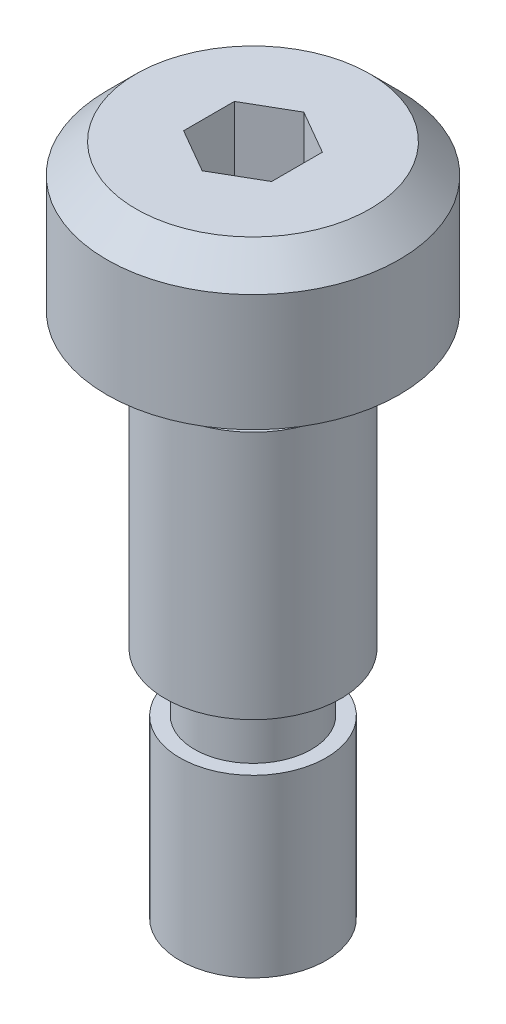
ISO-10303-21;
HEADER;
FILE_DESCRIPTION(('STEP AP214'),'2;1');
FILE_NAME('part.step','',(''),(''),'','','');
FILE_SCHEMA(('AUTOMOTIVE_DESIGN { 1 0 10303 214 1 1 1 1 }'));
ENDSEC;
DATA;
#1=APPLICATION_CONTEXT('core data for automotive mechanical design processes');
#2=APPLICATION_PROTOCOL_DEFINITION('international standard','automotive_design',2000,#1);
#3=PRODUCT_CONTEXT('',#1,'mechanical');
#4=PRODUCT('Part','Part','',(#3));
#5=PRODUCT_RELATED_PRODUCT_CATEGORY('part','',(#4));
#6=PRODUCT_DEFINITION_FORMATION('','',#4);
#7=PRODUCT_DEFINITION_CONTEXT('part definition',#1,'design');
#8=PRODUCT_DEFINITION('design','',#6,#7);
#9=PRODUCT_DEFINITION_SHAPE('','',#8);
#10=(LENGTH_UNIT() NAMED_UNIT(*) SI_UNIT(.MILLI.,.METRE.));
#11=(NAMED_UNIT(*) PLANE_ANGLE_UNIT() SI_UNIT($,.RADIAN.));
#12=(NAMED_UNIT(*) SI_UNIT($,.STERADIAN.) SOLID_ANGLE_UNIT());
#13=UNCERTAINTY_MEASURE_WITH_UNIT(LENGTH_MEASURE(1.E-05),#10,'distance_accuracy_value','');
#14=(GEOMETRIC_REPRESENTATION_CONTEXT(3) GLOBAL_UNCERTAINTY_ASSIGNED_CONTEXT((#13)) GLOBAL_UNIT_ASSIGNED_CONTEXT((#10,
#11,#12)) REPRESENTATION_CONTEXT('',''));
#15=CARTESIAN_POINT('',(0.,0.,0.));
#16=DIRECTION('',(0.,0.,1.));
#17=DIRECTION('',(1.,0.,0.));
#18=AXIS2_PLACEMENT_3D('',#15,#16,#17);
#19=CARTESIAN_POINT('',(0.,0.,0.));
#20=DIRECTION('',(0.,-1.,0.));
#21=DIRECTION('',(0.,0.,-1.));
#22=AXIS2_PLACEMENT_3D('',#19,#20,#21);
#23=PLANE('',#22);
#24=CARTESIAN_POINT('',(0.,0.,0.));
#25=DIRECTION('',(0.,-1.,0.));
#26=DIRECTION('',(0.,0.,-1.));
#27=AXIS2_PLACEMENT_3D('',#24,#25,#26);
#28=CIRCLE('',#27,4.445);
#29=CARTESIAN_POINT('',(0.,0.,-4.445));
#30=VERTEX_POINT('',#29);
#31=EDGE_CURVE('E11',#30,#30,#28,.T.);
#32=ORIENTED_EDGE('',*,*,#31,.F.);
#33=EDGE_LOOP('',(#32));
#34=FACE_BOUND('',#33,.T.);
#35=CARTESIAN_POINT('',(0.,0.,0.));
#36=DIRECTION('',(0.,-1.,0.));
#37=DIRECTION('',(0.,0.,-1.));
#38=AXIS2_PLACEMENT_3D('',#35,#36,#37);
#39=CIRCLE('',#38,7.9375);
#40=CARTESIAN_POINT('',(0.,0.,-7.9375));
#41=VERTEX_POINT('',#40);
#42=EDGE_CURVE('E45',#41,#41,#39,.T.);
#43=ORIENTED_EDGE('',*,*,#42,.T.);
#44=EDGE_LOOP('',(#43));
#45=FACE_BOUND('',#44,.T.);
#46=ADVANCED_FACE('F38',(#34,#45),#23,.T.);
#47=CARTESIAN_POINT('',(0.,0.,0.));
#48=DIRECTION('',(0.,-1.,0.));
#49=DIRECTION('',(0.,0.,-1.));
#50=AXIS2_PLACEMENT_3D('',#47,#48,#49);
#51=CYLINDRICAL_SURFACE('',#50,7.9375);
#52=CARTESIAN_POINT('',(0.,6.35,0.));
#53=DIRECTION('',(0.,-1.,0.));
#54=DIRECTION('',(0.,0.,-1.));
#55=AXIS2_PLACEMENT_3D('',#52,#53,#54);
#56=CIRCLE('',#55,7.9375);
#57=CARTESIAN_POINT('',(0.,6.35,-7.9375));
#58=VERTEX_POINT('',#57);
#59=EDGE_CURVE('E170',#58,#58,#56,.T.);
#60=ORIENTED_EDGE('',*,*,#59,.T.);
#61=EDGE_LOOP('',(#60));
#62=FACE_BOUND('',#61,.T.);
#63=ORIENTED_EDGE('',*,*,#42,.F.);
#64=EDGE_LOOP('',(#63));
#65=FACE_BOUND('',#64,.T.);
#66=ADVANCED_FACE('F176',(#62,#65),#51,.T.);
#67=CARTESIAN_POINT('',(0.,6.35,0.));
#68=DIRECTION('',(0.,-1.,0.));
#69=DIRECTION('',(0.,0.,-1.));
#70=AXIS2_PLACEMENT_3D('',#67,#68,#69);
#71=CONICAL_SURFACE('',#70,7.9375,0.785398163397452);
#72=CARTESIAN_POINT('',(0.,7.93749999999999,0.));
#73=DIRECTION('',(0.,-1.,0.));
#74=DIRECTION('',(0.,0.,-1.));
#75=AXIS2_PLACEMENT_3D('',#72,#73,#74);
#76=CIRCLE('',#75,6.35);
#77=CARTESIAN_POINT('',(0.,7.93749999999999,-6.35));
#78=VERTEX_POINT('',#77);
#79=EDGE_CURVE('E167',#78,#78,#76,.T.);
#80=ORIENTED_EDGE('',*,*,#79,.T.);
#81=EDGE_LOOP('',(#80));
#82=FACE_BOUND('',#81,.T.);
#83=ORIENTED_EDGE('',*,*,#59,.F.);
#84=EDGE_LOOP('',(#83));
#85=FACE_BOUND('',#84,.T.);
#86=ADVANCED_FACE('F178',(#82,#85),#71,.T.);
#87=CARTESIAN_POINT('',(6.35,7.93749999999999,0.));
#88=DIRECTION('',(0.,1.,0.));
#89=DIRECTION('',(0.,0.,1.));
#90=AXIS2_PLACEMENT_3D('',#87,#88,#89);
#91=PLANE('',#90);
#92=DIRECTION('',(-4.53589793478602E-07,0.,0.999999999999897));
#93=VECTOR('',#92,1.);
#94=CARTESIAN_POINT('',(-2.38759668147004,7.93749999999999,-1.37848223407189));
#95=LINE('',#94,#93);
#96=CARTESIAN_POINT('',(-2.38759668147004,7.93749999999999,-1.37848223407189));
#97=VERTEX_POINT('',#96);
#98=CARTESIAN_POINT('',(-2.387597932,7.93749999999999,1.37848006809235));
#99=VERTEX_POINT('',#98);
#100=EDGE_CURVE('E52',#97,#99,#95,.T.);
#101=ORIENTED_EDGE('',*,*,#100,.F.);
#102=DIRECTION('',(-0.866025781775686,0.,0.499999345299384));
#103=VECTOR('',#102,1.);
#104=CARTESIAN_POINT('',(1.87579371350743E-06,7.93749999999999,-2.75696049718073));
#105=LINE('',#104,#103);
#106=CARTESIAN_POINT('',(1.87579371350743E-06,7.93749999999999,-2.75696049718073));
#107=VERTEX_POINT('',#106);
#108=EDGE_CURVE('E122',#107,#97,#105,.T.);
#109=ORIENTED_EDGE('',*,*,#108,.F.);
#110=DIRECTION('',(-0.866025101391085,0.,-0.500000523760287));
#111=VECTOR('',#110,1.);
#112=CARTESIAN_POINT('',(2.38759855726424,7.93749999999999,-1.37847898510215));
#113=LINE('',#112,#111);
#114=CARTESIAN_POINT('',(2.38759855726424,7.93749999999999,-1.37847898510215));
#115=VERTEX_POINT('',#114);
#116=EDGE_CURVE('E116',#115,#107,#113,.T.);
#117=ORIENTED_EDGE('',*,*,#116,.F.);
#118=DIRECTION('',(4.53589793386286E-07,0.,-0.999999999999897));
#119=VECTOR('',#118,1.);
#120=CARTESIAN_POINT('',(2.38759730673527,7.93749999999999,1.37848115108226));
#121=LINE('',#120,#119);
#122=CARTESIAN_POINT('',(2.38759730673527,7.93749999999999,1.37848115108226));
#123=VERTEX_POINT('',#122);
#124=EDGE_CURVE('E114',#123,#115,#121,.T.);
#125=ORIENTED_EDGE('',*,*,#124,.F.);
#126=DIRECTION('',(0.866025554980997,0.,-0.499999738119788));
#127=VECTOR('',#126,1.);
#128=CARTESIAN_POINT('',(-6.25264571169187E-07,7.93749999999999,2.7569604971813));
#129=LINE('',#128,#127);
#130=CARTESIAN_POINT('',(-6.25264571169187E-07,7.93749999999999,2.7569604971813));
#131=VERTEX_POINT('',#130);
#132=EDGE_CURVE('E95',#131,#123,#129,.T.);
#133=ORIENTED_EDGE('',*,*,#132,.F.);
#134=DIRECTION('',(0.86602532818613,0.,0.500000130940089));
#135=VECTOR('',#134,1.);
#136=CARTESIAN_POINT('',(-2.387597932,7.93749999999999,1.37848006809235));
#137=LINE('',#136,#135);
#138=EDGE_CURVE('E106',#99,#131,#137,.T.);
#139=ORIENTED_EDGE('',*,*,#138,.F.);
#140=EDGE_LOOP('',(#101,#109,#117,#125,#133,#139));
#141=FACE_BOUND('',#140,.T.);
#142=ORIENTED_EDGE('',*,*,#79,.F.);
#143=EDGE_LOOP('',(#142));
#144=FACE_BOUND('',#143,.T.);
#145=ADVANCED_FACE('F110',(#141,#144),#91,.T.);
#146=CARTESIAN_POINT('',(0.,-28.575,0.));
#147=DIRECTION('',(0.,-1.,0.));
#148=DIRECTION('',(0.,0.,-1.));
#149=AXIS2_PLACEMENT_3D('',#146,#147,#148);
#150=PLANE('',#149);
#151=CARTESIAN_POINT('',(0.,-28.575,0.));
#152=DIRECTION('',(0.,-1.,0.));
#153=DIRECTION('',(0.,0.,-1.));
#154=AXIS2_PLACEMENT_3D('',#151,#152,#153);
#155=CIRCLE('',#154,3.96875);
#156=CARTESIAN_POINT('',(0.,-28.575,-3.96875));
#157=VERTEX_POINT('',#156);
#158=EDGE_CURVE('E164',#157,#157,#155,.T.);
#159=ORIENTED_EDGE('',*,*,#158,.T.);
#160=EDGE_LOOP('',(#159));
#161=FACE_BOUND('',#160,.T.);
#162=ADVANCED_FACE('F190',(#161),#150,.T.);
#163=CARTESIAN_POINT('',(0.,0.,0.));
#164=DIRECTION('',(0.,-1.,0.));
#165=DIRECTION('',(0.,0.,-1.));
#166=AXIS2_PLACEMENT_3D('',#163,#164,#165);
#167=CYLINDRICAL_SURFACE('',#166,3.96875);
#168=CARTESIAN_POINT('',(0.,-19.05,0.));
#169=DIRECTION('',(0.,-1.,0.));
#170=DIRECTION('',(0.,0.,-1.));
#171=AXIS2_PLACEMENT_3D('',#168,#169,#170);
#172=CIRCLE('',#171,3.96875);
#173=CARTESIAN_POINT('',(0.,-19.05,-3.96875));
#174=VERTEX_POINT('',#173);
#175=EDGE_CURVE('E161',#174,#174,#172,.T.);
#176=ORIENTED_EDGE('',*,*,#175,.T.);
#177=EDGE_LOOP('',(#176));
#178=FACE_BOUND('',#177,.T.);
#179=ORIENTED_EDGE('',*,*,#158,.F.);
#180=EDGE_LOOP('',(#179));
#181=FACE_BOUND('',#180,.T.);
#182=ADVANCED_FACE('F193',(#178,#181),#167,.T.);
#183=CARTESIAN_POINT('',(3.96875,-19.05,0.));
#184=DIRECTION('',(0.,1.,0.));
#185=DIRECTION('',(0.,0.,1.));
#186=AXIS2_PLACEMENT_3D('',#183,#184,#185);
#187=PLANE('',#186);
#188=CARTESIAN_POINT('',(0.,-19.05,0.));
#189=DIRECTION('',(0.,-1.,0.));
#190=DIRECTION('',(0.,0.,-1.));
#191=AXIS2_PLACEMENT_3D('',#188,#189,#190);
#192=CIRCLE('',#191,3.175);
#193=CARTESIAN_POINT('',(0.,-19.05,-3.175));
#194=VERTEX_POINT('',#193);
#195=EDGE_CURVE('E158',#194,#194,#192,.T.);
#196=ORIENTED_EDGE('',*,*,#195,.T.);
#197=EDGE_LOOP('',(#196));
#198=FACE_BOUND('',#197,.T.);
#199=ORIENTED_EDGE('',*,*,#175,.F.);
#200=EDGE_LOOP('',(#199));
#201=FACE_BOUND('',#200,.T.);
#202=ADVANCED_FACE('F197',(#198,#201),#187,.T.);
#203=CARTESIAN_POINT('',(0.,0.,0.));
#204=DIRECTION('',(0.,-1.,0.));
#205=DIRECTION('',(0.,0.,-1.));
#206=AXIS2_PLACEMENT_3D('',#203,#204,#205);
#207=CYLINDRICAL_SURFACE('',#206,3.175);
#208=CARTESIAN_POINT('',(0.,-15.875,0.));
#209=DIRECTION('',(0.,-1.,0.));
#210=DIRECTION('',(0.,0.,-1.));
#211=AXIS2_PLACEMENT_3D('',#208,#209,#210);
#212=CIRCLE('',#211,3.175);
#213=CARTESIAN_POINT('',(0.,-15.875,-3.175));
#214=VERTEX_POINT('',#213);
#215=EDGE_CURVE('E155',#214,#214,#212,.T.);
#216=ORIENTED_EDGE('',*,*,#215,.T.);
#217=EDGE_LOOP('',(#216));
#218=FACE_BOUND('',#217,.T.);
#219=ORIENTED_EDGE('',*,*,#195,.F.);
#220=EDGE_LOOP('',(#219));
#221=FACE_BOUND('',#220,.T.);
#222=ADVANCED_FACE('F201',(#218,#221),#207,.T.);
#223=CARTESIAN_POINT('',(3.175,-15.875,0.));
#224=DIRECTION('',(0.,-1.,0.));
#225=DIRECTION('',(0.,0.,-1.));
#226=AXIS2_PLACEMENT_3D('',#223,#224,#225);
#227=PLANE('',#226);
#228=CARTESIAN_POINT('',(0.,-15.875,0.));
#229=DIRECTION('',(0.,-1.,0.));
#230=DIRECTION('',(0.,0.,-1.));
#231=AXIS2_PLACEMENT_3D('',#228,#229,#230);
#232=CIRCLE('',#231,4.7625);
#233=CARTESIAN_POINT('',(0.,-15.875,-4.7625));
#234=VERTEX_POINT('',#233);
#235=EDGE_CURVE('E152',#234,#234,#232,.T.);
#236=ORIENTED_EDGE('',*,*,#235,.T.);
#237=EDGE_LOOP('',(#236));
#238=FACE_BOUND('',#237,.T.);
#239=ORIENTED_EDGE('',*,*,#215,.F.);
#240=EDGE_LOOP('',(#239));
#241=FACE_BOUND('',#240,.T.);
#242=ADVANCED_FACE('F205',(#238,#241),#227,.T.);
#243=CARTESIAN_POINT('',(0.,0.,0.));
#244=DIRECTION('',(0.,-1.,0.));
#245=DIRECTION('',(0.,0.,-1.));
#246=AXIS2_PLACEMENT_3D('',#243,#244,#245);
#247=CYLINDRICAL_SURFACE('',#246,4.7625);
#248=CARTESIAN_POINT('',(0.,-2.362197954,0.));
#249=DIRECTION('',(0.,-1.,0.));
#250=DIRECTION('',(0.,0.,-1.));
#251=AXIS2_PLACEMENT_3D('',#248,#249,#250);
#252=CIRCLE('',#251,4.7625);
#253=CARTESIAN_POINT('',(0.,-2.362197954,-4.7625));
#254=VERTEX_POINT('',#253);
#255=EDGE_CURVE('E149',#254,#254,#252,.T.);
#256=ORIENTED_EDGE('',*,*,#255,.T.);
#257=EDGE_LOOP('',(#256));
#258=FACE_BOUND('',#257,.T.);
#259=ORIENTED_EDGE('',*,*,#235,.F.);
#260=EDGE_LOOP('',(#259));
#261=FACE_BOUND('',#260,.T.);
#262=ADVANCED_FACE('F209',(#258,#261),#247,.T.);
#263=CARTESIAN_POINT('',(4.7625,-2.362197954,0.));
#264=DIRECTION('',(0.,1.,0.));
#265=DIRECTION('',(0.,0.,1.));
#266=AXIS2_PLACEMENT_3D('',#263,#264,#265);
#267=PLANE('',#266);
#268=CARTESIAN_POINT('',(0.,-2.362197954,0.));
#269=DIRECTION('',(0.,-1.,0.));
#270=DIRECTION('',(0.,0.,-1.));
#271=AXIS2_PLACEMENT_3D('',#268,#269,#270);
#272=CIRCLE('',#271,4.445);
#273=CARTESIAN_POINT('',(0.,-2.362197954,-4.445));
#274=VERTEX_POINT('',#273);
#275=EDGE_CURVE('E140',#274,#274,#272,.T.);
#276=ORIENTED_EDGE('',*,*,#275,.T.);
#277=EDGE_LOOP('',(#276));
#278=FACE_BOUND('',#277,.T.);
#279=ORIENTED_EDGE('',*,*,#255,.F.);
#280=EDGE_LOOP('',(#279));
#281=FACE_BOUND('',#280,.T.);
#282=ADVANCED_FACE('F213',(#278,#281),#267,.T.);
#283=CARTESIAN_POINT('',(0.,0.,0.));
#284=DIRECTION('',(0.,-1.,0.));
#285=DIRECTION('',(0.,0.,-1.));
#286=AXIS2_PLACEMENT_3D('',#283,#284,#285);
#287=CYLINDRICAL_SURFACE('',#286,4.445);
#288=ORIENTED_EDGE('',*,*,#31,.T.);
#289=EDGE_LOOP('',(#288));
#290=FACE_BOUND('',#289,.T.);
#291=ORIENTED_EDGE('',*,*,#275,.F.);
#292=EDGE_LOOP('',(#291));
#293=FACE_BOUND('',#292,.T.);
#294=ADVANCED_FACE('F217',(#290,#293),#287,.T.);
#295=CARTESIAN_POINT('',(-2.38759668147004,4.35610310199999,-1.37848223407189));
#296=DIRECTION('',(-0.999999999999897,0.,-4.53589793478602E-07));
#297=DIRECTION('',(-4.53589793478602E-07,0.,0.999999999999897));
#298=AXIS2_PLACEMENT_3D('',#295,#296,#297);
#299=PLANE('',#298);
#300=ORIENTED_EDGE('',*,*,#100,.T.);
#301=DIRECTION('',(0.,1.,0.));
#302=VECTOR('',#301,1.);
#303=CARTESIAN_POINT('',(-2.387597932,4.35610310199999,1.37848006809235));
#304=LINE('',#303,#302);
#305=CARTESIAN_POINT('',(-2.387597932,4.35610310199999,1.37848006809235));
#306=VERTEX_POINT('',#305);
#307=EDGE_CURVE('E103',#306,#99,#304,.T.);
#308=ORIENTED_EDGE('',*,*,#307,.F.);
#309=DIRECTION('',(-4.53589793478602E-07,0.,0.999999999999897));
#310=VECTOR('',#309,1.);
#311=CARTESIAN_POINT('',(-2.38759668147004,4.35610310199999,-1.37848223407189));
#312=LINE('',#311,#310);
#313=CARTESIAN_POINT('',(-2.38759668147004,4.35610310199999,-1.37848223407189));
#314=VERTEX_POINT('',#313);
#315=EDGE_CURVE('E124',#314,#306,#312,.T.);
#316=ORIENTED_EDGE('',*,*,#315,.F.);
#317=DIRECTION('',(0.,1.,0.));
#318=VECTOR('',#317,1.);
#319=CARTESIAN_POINT('',(-2.38759668147004,4.35610310199999,-1.37848223407189));
#320=LINE('',#319,#318);
#321=EDGE_CURVE('E59',#314,#97,#320,.T.);
#322=ORIENTED_EDGE('',*,*,#321,.T.);
#323=EDGE_LOOP('',(#300,#308,#316,#322));
#324=FACE_BOUND('',#323,.T.);
#325=ADVANCED_FACE('F221',(#324),#299,.F.);
#326=CARTESIAN_POINT('',(1.87579371350743E-06,4.35610310199999,-2.75696049718073));
#327=DIRECTION('',(-0.499999345299384,0.,-0.866025781775686));
#328=DIRECTION('',(-0.866025781775686,0.,0.499999345299384));
#329=AXIS2_PLACEMENT_3D('',#326,#327,#328);
#330=PLANE('',#329);
#331=ORIENTED_EDGE('',*,*,#108,.T.);
#332=ORIENTED_EDGE('',*,*,#321,.F.);
#333=DIRECTION('',(-0.866025781775686,0.,0.499999345299384));
#334=VECTOR('',#333,1.);
#335=CARTESIAN_POINT('',(1.87579371350743E-06,4.35610310199999,-2.75696049718073));
#336=LINE('',#335,#334);
#337=CARTESIAN_POINT('',(1.87579371350743E-06,4.35610310199999,-2.75696049718073));
#338=VERTEX_POINT('',#337);
#339=EDGE_CURVE('E136',#338,#314,#336,.T.);
#340=ORIENTED_EDGE('',*,*,#339,.F.);
#341=DIRECTION('',(0.,1.,0.));
#342=VECTOR('',#341,1.);
#343=CARTESIAN_POINT('',(1.87579371350743E-06,4.35610310199999,-2.75696049718073));
#344=LINE('',#343,#342);
#345=EDGE_CURVE('E141',#338,#107,#344,.T.);
#346=ORIENTED_EDGE('',*,*,#345,.T.);
#347=EDGE_LOOP('',(#331,#332,#340,#346));
#348=FACE_BOUND('',#347,.T.);
#349=ADVANCED_FACE('F225',(#348),#330,.F.);
#350=CARTESIAN_POINT('',(2.38759855726424,4.35610310199999,-1.37847898510215));
#351=DIRECTION('',(0.500000523760287,0.,-0.866025101391085));
#352=DIRECTION('',(-0.866025101391085,0.,-0.500000523760287));
#353=AXIS2_PLACEMENT_3D('',#350,#351,#352);
#354=PLANE('',#353);
#355=ORIENTED_EDGE('',*,*,#116,.T.);
#356=ORIENTED_EDGE('',*,*,#345,.F.);
#357=DIRECTION('',(-0.866025101391085,0.,-0.500000523760287));
#358=VECTOR('',#357,1.);
#359=CARTESIAN_POINT('',(2.38759855726424,4.35610310199999,-1.37847898510215));
#360=LINE('',#359,#358);
#361=CARTESIAN_POINT('',(2.38759855726424,4.35610310199999,-1.37847898510215));
#362=VERTEX_POINT('',#361);
#363=EDGE_CURVE('E133',#362,#338,#360,.T.);
#364=ORIENTED_EDGE('',*,*,#363,.F.);
#365=DIRECTION('',(0.,1.,0.));
#366=VECTOR('',#365,1.);
#367=CARTESIAN_POINT('',(2.38759855726424,4.35610310199999,-1.37847898510215));
#368=LINE('',#367,#366);
#369=EDGE_CURVE('E143',#362,#115,#368,.T.);
#370=ORIENTED_EDGE('',*,*,#369,.T.);
#371=EDGE_LOOP('',(#355,#356,#364,#370));
#372=FACE_BOUND('',#371,.T.);
#373=ADVANCED_FACE('F234',(#372),#354,.F.);
#374=CARTESIAN_POINT('',(2.38759730673527,4.35610310199999,1.37848115108226));
#375=DIRECTION('',(0.999999999999897,0.,4.53589793386286E-07));
#376=DIRECTION('',(4.53589793386287E-07,0.,-0.999999999999897));
#377=AXIS2_PLACEMENT_3D('',#374,#375,#376);
#378=PLANE('',#377);
#379=ORIENTED_EDGE('',*,*,#124,.T.);
#380=ORIENTED_EDGE('',*,*,#369,.F.);
#381=DIRECTION('',(4.53589793386286E-07,0.,-0.999999999999897));
#382=VECTOR('',#381,1.);
#383=CARTESIAN_POINT('',(2.38759730673527,4.35610310199999,1.37848115108226));
#384=LINE('',#383,#382);
#385=CARTESIAN_POINT('',(2.38759730673527,4.35610310199999,1.37848115108226));
#386=VERTEX_POINT('',#385);
#387=EDGE_CURVE('E130',#386,#362,#384,.T.);
#388=ORIENTED_EDGE('',*,*,#387,.F.);
#389=DIRECTION('',(0.,1.,0.));
#390=VECTOR('',#389,1.);
#391=CARTESIAN_POINT('',(2.38759730673527,4.35610310199999,1.37848115108226));
#392=LINE('',#391,#390);
#393=EDGE_CURVE('E102',#386,#123,#392,.T.);
#394=ORIENTED_EDGE('',*,*,#393,.T.);
#395=EDGE_LOOP('',(#379,#380,#388,#394));
#396=FACE_BOUND('',#395,.T.);
#397=ADVANCED_FACE('F231',(#396),#378,.F.);
#398=CARTESIAN_POINT('',(-6.25264571169187E-07,4.35610310199999,2.7569604971813));
#399=DIRECTION('',(0.499999738119788,0.,0.866025554980997));
#400=DIRECTION('',(0.866025554980997,0.,-0.499999738119788));
#401=AXIS2_PLACEMENT_3D('',#398,#399,#400);
#402=PLANE('',#401);
#403=ORIENTED_EDGE('',*,*,#132,.T.);
#404=ORIENTED_EDGE('',*,*,#393,.F.);
#405=DIRECTION('',(0.866025554980997,0.,-0.499999738119788));
#406=VECTOR('',#405,1.);
#407=CARTESIAN_POINT('',(-6.25264571169187E-07,4.35610310199999,2.7569604971813));
#408=LINE('',#407,#406);
#409=CARTESIAN_POINT('',(-6.25264571169187E-07,4.35610310199999,2.7569604971813));
#410=VERTEX_POINT('',#409);
#411=EDGE_CURVE('E98',#410,#386,#408,.T.);
#412=ORIENTED_EDGE('',*,*,#411,.F.);
#413=DIRECTION('',(0.,1.,0.));
#414=VECTOR('',#413,1.);
#415=CARTESIAN_POINT('',(-6.25264571169187E-07,4.35610310199999,2.7569604971813));
#416=LINE('',#415,#414);
#417=EDGE_CURVE('E91',#410,#131,#416,.T.);
#418=ORIENTED_EDGE('',*,*,#417,.T.);
#419=EDGE_LOOP('',(#403,#404,#412,#418));
#420=FACE_BOUND('',#419,.T.);
#421=ADVANCED_FACE('F93',(#420),#402,.F.);
#422=CARTESIAN_POINT('',(-2.387597932,4.35610310199999,1.37848006809235));
#423=DIRECTION('',(-0.500000130940089,0.,0.86602532818613));
#424=DIRECTION('',(0.86602532818613,0.,0.500000130940089));
#425=AXIS2_PLACEMENT_3D('',#422,#423,#424);
#426=PLANE('',#425);
#427=ORIENTED_EDGE('',*,*,#138,.T.);
#428=ORIENTED_EDGE('',*,*,#417,.F.);
#429=DIRECTION('',(0.86602532818613,0.,0.500000130940089));
#430=VECTOR('',#429,1.);
#431=CARTESIAN_POINT('',(-2.387597932,4.35610310199999,1.37848006809235));
#432=LINE('',#431,#430);
#433=EDGE_CURVE('E127',#306,#410,#432,.T.);
#434=ORIENTED_EDGE('',*,*,#433,.F.);
#435=ORIENTED_EDGE('',*,*,#307,.T.);
#436=EDGE_LOOP('',(#427,#428,#434,#435));
#437=FACE_BOUND('',#436,.T.);
#438=ADVANCED_FACE('F107',(#437),#426,.F.);
#439=CARTESIAN_POINT('',(-2.387597932,4.35610310199999,1.37848006809235));
#440=DIRECTION('',(0.,1.,0.));
#441=DIRECTION('',(0.,0.,1.));
#442=AXIS2_PLACEMENT_3D('',#439,#440,#441);
#443=PLANE('',#442);
#444=ORIENTED_EDGE('',*,*,#315,.T.);
#445=ORIENTED_EDGE('',*,*,#433,.T.);
#446=ORIENTED_EDGE('',*,*,#411,.T.);
#447=ORIENTED_EDGE('',*,*,#387,.T.);
#448=ORIENTED_EDGE('',*,*,#363,.T.);
#449=ORIENTED_EDGE('',*,*,#339,.T.);
#450=EDGE_LOOP('',(#444,#445,#446,#447,#448,#449));
#451=FACE_BOUND('',#450,.T.);
#452=ADVANCED_FACE('F228',(#451),#443,.T.);
#453=CLOSED_SHELL('',(#46,#66,#86,#145,#162,#182,#202,#222,#242,#262,#282,#294,#325,#349,#373,
#397,#421,#438,#452));
#454=MANIFOLD_SOLID_BREP('B2',#453);
#455=ADVANCED_BREP_SHAPE_REPRESENTATION('',(#18,#454),#14);
#456=SHAPE_DEFINITION_REPRESENTATION(#9,#455);
ENDSEC;
END-ISO-10303-21;
